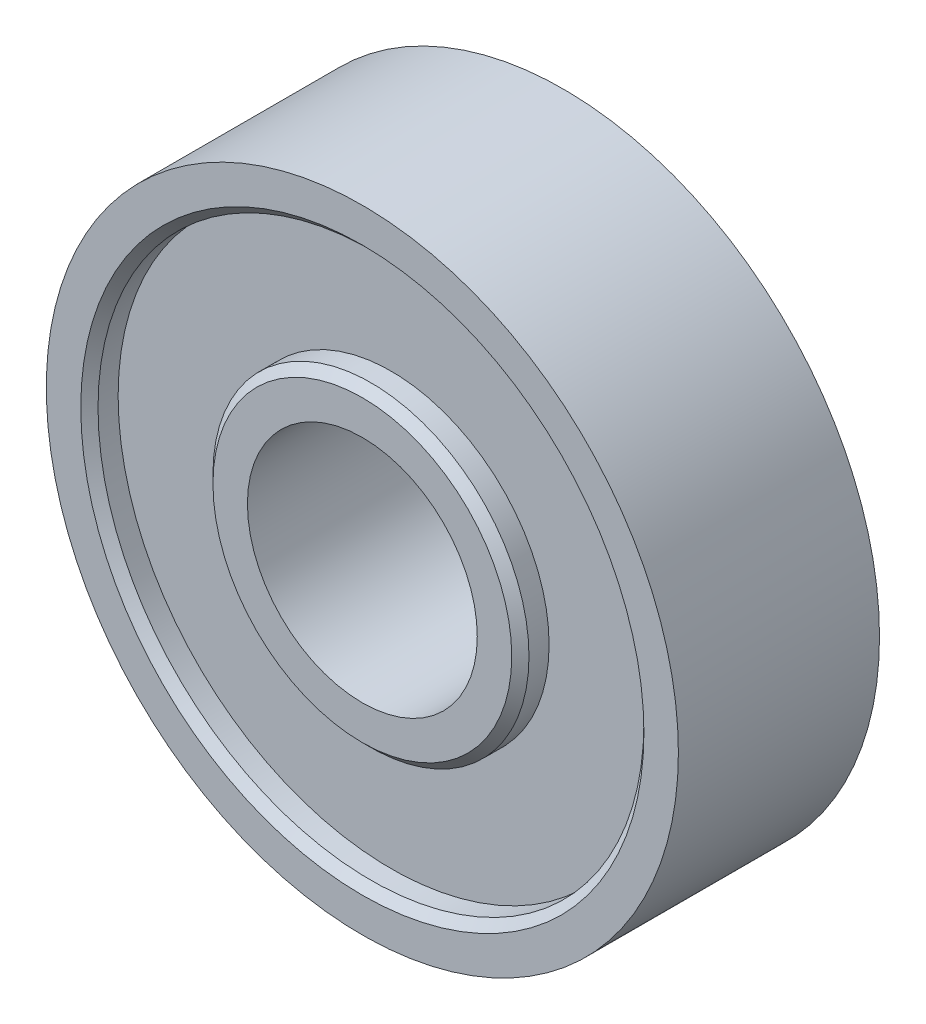
ISO-10303-21;
HEADER;
FILE_DESCRIPTION(('STEP AP214'),'2;1');
FILE_NAME('part.step','',(''),(''),'','','');
FILE_SCHEMA(('AUTOMOTIVE_DESIGN { 1 0 10303 214 1 1 1 1 }'));
ENDSEC;
DATA;
#1=APPLICATION_CONTEXT('core data for automotive mechanical design processes');
#2=APPLICATION_PROTOCOL_DEFINITION('international standard','automotive_design',2000,#1);
#3=PRODUCT_CONTEXT('',#1,'mechanical');
#4=PRODUCT('Part','Part','',(#3));
#5=PRODUCT_RELATED_PRODUCT_CATEGORY('part','',(#4));
#6=PRODUCT_DEFINITION_FORMATION('','',#4);
#7=PRODUCT_DEFINITION_CONTEXT('part definition',#1,'design');
#8=PRODUCT_DEFINITION('design','',#6,#7);
#9=PRODUCT_DEFINITION_SHAPE('','',#8);
#10=(LENGTH_UNIT() NAMED_UNIT(*) SI_UNIT(.MILLI.,.METRE.));
#11=(NAMED_UNIT(*) PLANE_ANGLE_UNIT() SI_UNIT($,.RADIAN.));
#12=(NAMED_UNIT(*) SI_UNIT($,.STERADIAN.) SOLID_ANGLE_UNIT());
#13=UNCERTAINTY_MEASURE_WITH_UNIT(LENGTH_MEASURE(1.E-05),#10,'distance_accuracy_value','');
#14=(GEOMETRIC_REPRESENTATION_CONTEXT(3) GLOBAL_UNCERTAINTY_ASSIGNED_CONTEXT((#13)) GLOBAL_UNIT_ASSIGNED_CONTEXT((#10,
#11,#12)) REPRESENTATION_CONTEXT('',''));
#15=CARTESIAN_POINT('',(0.,0.,0.));
#16=DIRECTION('',(0.,0.,1.));
#17=DIRECTION('',(1.,0.,0.));
#18=AXIS2_PLACEMENT_3D('',#15,#16,#17);
#19=CARTESIAN_POINT('',(0.,0.,-3.5));
#20=DIRECTION('',(0.,0.,1.));
#21=DIRECTION('',(1.,0.,0.));
#22=AXIS2_PLACEMENT_3D('',#19,#20,#21);
#23=PLANE('',#22);
#24=CARTESIAN_POINT('',(0.,0.,-3.5));
#25=DIRECTION('',(0.,0.,1.));
#26=DIRECTION('',(1.,0.,0.));
#27=AXIS2_PLACEMENT_3D('',#24,#25,#26);
#28=CIRCLE('',#27,5.2);
#29=CARTESIAN_POINT('',(5.2,0.,-3.5));
#30=VERTEX_POINT('',#29);
#31=EDGE_CURVE('E87',#30,#30,#28,.F.);
#32=ORIENTED_EDGE('',*,*,#31,.T.);
#33=EDGE_LOOP('',(#32));
#34=FACE_BOUND('',#33,.T.);
#35=CARTESIAN_POINT('',(0.,0.,-3.5));
#36=DIRECTION('',(0.,0.,1.));
#37=DIRECTION('',(1.,0.,0.));
#38=AXIS2_PLACEMENT_3D('',#35,#36,#37);
#39=CIRCLE('',#38,4.);
#40=CARTESIAN_POINT('',(4.,0.,-3.5));
#41=VERTEX_POINT('',#40);
#42=EDGE_CURVE('E107',#41,#41,#39,.T.);
#43=ORIENTED_EDGE('',*,*,#42,.T.);
#44=EDGE_LOOP('',(#43));
#45=FACE_BOUND('',#44,.T.);
#46=ADVANCED_FACE('F46',(#34,#45),#23,.F.);
#47=CARTESIAN_POINT('',(0.,0.,3.5));
#48=DIRECTION('',(0.,0.,1.));
#49=DIRECTION('',(1.,0.,0.));
#50=AXIS2_PLACEMENT_3D('',#47,#48,#49);
#51=PLANE('',#50);
#52=CARTESIAN_POINT('',(0.,0.,3.5));
#53=DIRECTION('',(0.,0.,1.));
#54=DIRECTION('',(1.,0.,0.));
#55=AXIS2_PLACEMENT_3D('',#52,#53,#54);
#56=CIRCLE('',#55,5.2);
#57=CARTESIAN_POINT('',(5.2,0.,3.5));
#58=VERTEX_POINT('',#57);
#59=EDGE_CURVE('E117',#58,#58,#56,.T.);
#60=ORIENTED_EDGE('',*,*,#59,.T.);
#61=EDGE_LOOP('',(#60));
#62=FACE_BOUND('',#61,.T.);
#63=CARTESIAN_POINT('',(0.,0.,3.5));
#64=DIRECTION('',(0.,0.,1.));
#65=DIRECTION('',(1.,0.,0.));
#66=AXIS2_PLACEMENT_3D('',#63,#64,#65);
#67=CIRCLE('',#66,4.);
#68=CARTESIAN_POINT('',(4.,0.,3.5));
#69=VERTEX_POINT('',#68);
#70=EDGE_CURVE('E80',#69,#69,#67,.T.);
#71=ORIENTED_EDGE('',*,*,#70,.F.);
#72=EDGE_LOOP('',(#71));
#73=FACE_BOUND('',#72,.T.);
#74=ADVANCED_FACE('F156',(#62,#73),#51,.T.);
#75=CARTESIAN_POINT('',(0.,0.,3.5));
#76=DIRECTION('',(0.,0.,1.));
#77=DIRECTION('',(1.,0.,0.));
#78=AXIS2_PLACEMENT_3D('',#75,#76,#77);
#79=CIRCLE('',#78,9.79999999999999);
#80=CARTESIAN_POINT('',(9.79999999999999,0.,3.5));
#81=VERTEX_POINT('',#80);
#82=EDGE_CURVE('E57',#81,#81,#79,.F.);
#83=ORIENTED_EDGE('',*,*,#82,.T.);
#84=EDGE_LOOP('',(#83));
#85=FACE_BOUND('',#84,.T.);
#86=CARTESIAN_POINT('',(0.,0.,3.5));
#87=DIRECTION('',(0.,0.,1.));
#88=DIRECTION('',(1.,0.,0.));
#89=AXIS2_PLACEMENT_3D('',#86,#87,#88);
#90=CIRCLE('',#89,11.);
#91=CARTESIAN_POINT('',(11.,0.,3.5));
#92=VERTEX_POINT('',#91);
#93=EDGE_CURVE('E79',#92,#92,#90,.T.);
#94=ORIENTED_EDGE('',*,*,#93,.T.);
#95=EDGE_LOOP('',(#94));
#96=FACE_BOUND('',#95,.T.);
#97=ADVANCED_FACE('F162',(#85,#96),#51,.T.);
#98=CARTESIAN_POINT('',(0.,0.,-3.5));
#99=DIRECTION('',(0.,0.,1.));
#100=DIRECTION('',(1.,0.,0.));
#101=AXIS2_PLACEMENT_3D('',#98,#99,#100);
#102=CIRCLE('',#101,9.8);
#103=CARTESIAN_POINT('',(9.8,0.,-3.5));
#104=VERTEX_POINT('',#103);
#105=EDGE_CURVE('E53',#104,#104,#102,.T.);
#106=ORIENTED_EDGE('',*,*,#105,.T.);
#107=EDGE_LOOP('',(#106));
#108=FACE_BOUND('',#107,.T.);
#109=CARTESIAN_POINT('',(0.,0.,-3.5));
#110=DIRECTION('',(0.,0.,1.));
#111=DIRECTION('',(1.,0.,0.));
#112=AXIS2_PLACEMENT_3D('',#109,#110,#111);
#113=CIRCLE('',#112,11.);
#114=CARTESIAN_POINT('',(11.,0.,-3.5));
#115=VERTEX_POINT('',#114);
#116=EDGE_CURVE('E74',#115,#115,#113,.T.);
#117=ORIENTED_EDGE('',*,*,#116,.F.);
#118=EDGE_LOOP('',(#117));
#119=FACE_BOUND('',#118,.T.);
#120=ADVANCED_FACE('F158',(#108,#119),#23,.F.);
#121=CARTESIAN_POINT('',(0.,0.,3.5));
#122=DIRECTION('',(0.,0.,-1.));
#123=DIRECTION('',(-1.,0.,0.));
#124=AXIS2_PLACEMENT_3D('',#121,#122,#123);
#125=CYLINDRICAL_SURFACE('',#124,11.);
#126=ORIENTED_EDGE('',*,*,#93,.F.);
#127=EDGE_LOOP('',(#126));
#128=FACE_BOUND('',#127,.T.);
#129=ORIENTED_EDGE('',*,*,#116,.T.);
#130=EDGE_LOOP('',(#129));
#131=FACE_BOUND('',#130,.T.);
#132=ADVANCED_FACE('F166',(#128,#131),#125,.T.);
#133=CARTESIAN_POINT('',(0.,0.,3.5));
#134=DIRECTION('',(0.,0.,-1.));
#135=DIRECTION('',(-1.,0.,0.));
#136=AXIS2_PLACEMENT_3D('',#133,#134,#135);
#137=CYLINDRICAL_SURFACE('',#136,4.);
#138=ORIENTED_EDGE('',*,*,#70,.T.);
#139=EDGE_LOOP('',(#138));
#140=FACE_BOUND('',#139,.T.);
#141=ORIENTED_EDGE('',*,*,#42,.F.);
#142=EDGE_LOOP('',(#141));
#143=FACE_BOUND('',#142,.T.);
#144=ADVANCED_FACE('F171',(#140,#143),#137,.F.);
#145=CARTESIAN_POINT('',(0.,0.,2.5));
#146=DIRECTION('',(0.,0.,1.));
#147=DIRECTION('',(1.,0.,0.));
#148=AXIS2_PLACEMENT_3D('',#145,#146,#147);
#149=CYLINDRICAL_SURFACE('',#148,9.5);
#150=CARTESIAN_POINT('',(0.,0.,3.20000000000001));
#151=DIRECTION('',(0.,0.,1.));
#152=DIRECTION('',(1.,0.,0.));
#153=AXIS2_PLACEMENT_3D('',#150,#151,#152);
#154=CIRCLE('',#153,9.5);
#155=CARTESIAN_POINT('',(9.5,0.,3.20000000000001));
#156=VERTEX_POINT('',#155);
#157=EDGE_CURVE('E61',#156,#156,#154,.T.);
#158=ORIENTED_EDGE('',*,*,#157,.T.);
#159=EDGE_LOOP('',(#158));
#160=FACE_BOUND('',#159,.T.);
#161=CARTESIAN_POINT('',(0.,0.,2.5));
#162=DIRECTION('',(0.,0.,1.));
#163=DIRECTION('',(1.,0.,0.));
#164=AXIS2_PLACEMENT_3D('',#161,#162,#163);
#165=CIRCLE('',#164,9.5);
#166=CARTESIAN_POINT('',(9.5,0.,2.5));
#167=VERTEX_POINT('',#166);
#168=EDGE_CURVE('E103',#167,#167,#165,.T.);
#169=ORIENTED_EDGE('',*,*,#168,.F.);
#170=EDGE_LOOP('',(#169));
#171=FACE_BOUND('',#170,.T.);
#172=ADVANCED_FACE('F183',(#160,#171),#149,.F.);
#173=CARTESIAN_POINT('',(0.,0.,2.5));
#174=DIRECTION('',(0.,0.,1.));
#175=DIRECTION('',(1.,0.,0.));
#176=AXIS2_PLACEMENT_3D('',#173,#174,#175);
#177=PLANE('',#176);
#178=CARTESIAN_POINT('',(0.,0.,2.5));
#179=DIRECTION('',(0.,0.,1.));
#180=DIRECTION('',(1.,0.,0.));
#181=AXIS2_PLACEMENT_3D('',#178,#179,#180);
#182=CIRCLE('',#181,5.5);
#183=CARTESIAN_POINT('',(5.5,0.,2.5));
#184=VERTEX_POINT('',#183);
#185=EDGE_CURVE('E99',#184,#184,#182,.T.);
#186=ORIENTED_EDGE('',*,*,#185,.F.);
#187=EDGE_LOOP('',(#186));
#188=FACE_BOUND('',#187,.T.);
#189=ORIENTED_EDGE('',*,*,#168,.T.);
#190=EDGE_LOOP('',(#189));
#191=FACE_BOUND('',#190,.T.);
#192=ADVANCED_FACE('F151',(#188,#191),#177,.T.);
#193=CARTESIAN_POINT('',(0.,0.,2.5));
#194=DIRECTION('',(0.,0.,1.));
#195=DIRECTION('',(1.,0.,0.));
#196=AXIS2_PLACEMENT_3D('',#193,#194,#195);
#197=CYLINDRICAL_SURFACE('',#196,5.5);
#198=CARTESIAN_POINT('',(0.,0.,3.2));
#199=DIRECTION('',(0.,0.,1.));
#200=DIRECTION('',(1.,0.,0.));
#201=AXIS2_PLACEMENT_3D('',#198,#199,#200);
#202=CIRCLE('',#201,5.5);
#203=CARTESIAN_POINT('',(5.5,0.,3.2));
#204=VERTEX_POINT('',#203);
#205=EDGE_CURVE('E115',#204,#204,#202,.F.);
#206=ORIENTED_EDGE('',*,*,#205,.T.);
#207=EDGE_LOOP('',(#206));
#208=FACE_BOUND('',#207,.T.);
#209=ORIENTED_EDGE('',*,*,#185,.T.);
#210=EDGE_LOOP('',(#209));
#211=FACE_BOUND('',#210,.T.);
#212=ADVANCED_FACE('F143',(#208,#211),#197,.T.);
#213=CARTESIAN_POINT('',(0.,0.,-2.5));
#214=DIRECTION('',(0.,0.,-1.));
#215=DIRECTION('',(1.,0.,0.));
#216=AXIS2_PLACEMENT_3D('',#213,#214,#215);
#217=PLANE('',#216);
#218=CARTESIAN_POINT('',(0.,0.,-2.5));
#219=DIRECTION('',(0.,0.,1.));
#220=DIRECTION('',(1.,0.,0.));
#221=AXIS2_PLACEMENT_3D('',#218,#219,#220);
#222=CIRCLE('',#221,9.5);
#223=CARTESIAN_POINT('',(9.5,0.,-2.5));
#224=VERTEX_POINT('',#223);
#225=EDGE_CURVE('E96',#224,#224,#222,.T.);
#226=ORIENTED_EDGE('',*,*,#225,.F.);
#227=EDGE_LOOP('',(#226));
#228=FACE_BOUND('',#227,.T.);
#229=CARTESIAN_POINT('',(0.,0.,-2.5));
#230=DIRECTION('',(0.,0.,1.));
#231=DIRECTION('',(1.,0.,0.));
#232=AXIS2_PLACEMENT_3D('',#229,#230,#231);
#233=CIRCLE('',#232,5.5);
#234=CARTESIAN_POINT('',(5.5,0.,-2.5));
#235=VERTEX_POINT('',#234);
#236=EDGE_CURVE('E93',#235,#235,#233,.T.);
#237=ORIENTED_EDGE('',*,*,#236,.T.);
#238=EDGE_LOOP('',(#237));
#239=FACE_BOUND('',#238,.T.);
#240=ADVANCED_FACE('F141',(#228,#239),#217,.T.);
#241=CARTESIAN_POINT('',(0.,0.,-2.5));
#242=DIRECTION('',(0.,0.,-1.));
#243=DIRECTION('',(-1.,0.,0.));
#244=AXIS2_PLACEMENT_3D('',#241,#242,#243);
#245=CYLINDRICAL_SURFACE('',#244,9.5);
#246=CARTESIAN_POINT('',(0.,0.,-3.2));
#247=DIRECTION('',(0.,0.,1.));
#248=DIRECTION('',(1.,0.,0.));
#249=AXIS2_PLACEMENT_3D('',#246,#247,#248);
#250=CIRCLE('',#249,9.5);
#251=CARTESIAN_POINT('',(9.5,0.,-3.2));
#252=VERTEX_POINT('',#251);
#253=EDGE_CURVE('E12',#252,#252,#250,.F.);
#254=ORIENTED_EDGE('',*,*,#253,.T.);
#255=EDGE_LOOP('',(#254));
#256=FACE_BOUND('',#255,.T.);
#257=ORIENTED_EDGE('',*,*,#225,.T.);
#258=EDGE_LOOP('',(#257));
#259=FACE_BOUND('',#258,.T.);
#260=ADVANCED_FACE('F137',(#256,#259),#245,.F.);
#261=CARTESIAN_POINT('',(0.,0.,-2.5));
#262=DIRECTION('',(0.,0.,-1.));
#263=DIRECTION('',(-1.,0.,0.));
#264=AXIS2_PLACEMENT_3D('',#261,#262,#263);
#265=CYLINDRICAL_SURFACE('',#264,5.5);
#266=CARTESIAN_POINT('',(0.,0.,-3.2));
#267=DIRECTION('',(0.,0.,1.));
#268=DIRECTION('',(1.,0.,0.));
#269=AXIS2_PLACEMENT_3D('',#266,#267,#268);
#270=CIRCLE('',#269,5.5);
#271=CARTESIAN_POINT('',(5.5,0.,-3.2));
#272=VERTEX_POINT('',#271);
#273=EDGE_CURVE('E83',#272,#272,#270,.T.);
#274=ORIENTED_EDGE('',*,*,#273,.T.);
#275=EDGE_LOOP('',(#274));
#276=FACE_BOUND('',#275,.T.);
#277=ORIENTED_EDGE('',*,*,#236,.F.);
#278=EDGE_LOOP('',(#277));
#279=FACE_BOUND('',#278,.T.);
#280=ADVANCED_FACE('F131',(#276,#279),#265,.T.);
#281=CARTESIAN_POINT('',(0.,0.,-3.2));
#282=DIRECTION('',(0.,0.,1.));
#283=DIRECTION('',(1.,0.,0.));
#284=AXIS2_PLACEMENT_3D('',#281,#282,#283);
#285=CONICAL_SURFACE('',#284,5.5,0.785398163397451);
#286=ORIENTED_EDGE('',*,*,#31,.F.);
#287=EDGE_LOOP('',(#286));
#288=FACE_BOUND('',#287,.T.);
#289=ORIENTED_EDGE('',*,*,#273,.F.);
#290=EDGE_LOOP('',(#289));
#291=FACE_BOUND('',#290,.T.);
#292=ADVANCED_FACE('F127',(#288,#291),#285,.T.);
#293=CARTESIAN_POINT('',(0.,0.,3.5));
#294=DIRECTION('',(0.,0.,-1.));
#295=DIRECTION('',(-1.,0.,0.));
#296=AXIS2_PLACEMENT_3D('',#293,#294,#295);
#297=CONICAL_SURFACE('',#296,5.2,0.785398163397451);
#298=ORIENTED_EDGE('',*,*,#205,.F.);
#299=EDGE_LOOP('',(#298));
#300=FACE_BOUND('',#299,.T.);
#301=ORIENTED_EDGE('',*,*,#59,.F.);
#302=EDGE_LOOP('',(#301));
#303=FACE_BOUND('',#302,.T.);
#304=ADVANCED_FACE('F130',(#300,#303),#297,.T.);
#305=CARTESIAN_POINT('',(0.,0.,3.20000000000001));
#306=DIRECTION('',(0.,0.,1.));
#307=DIRECTION('',(1.,0.,0.));
#308=AXIS2_PLACEMENT_3D('',#305,#306,#307);
#309=CONICAL_SURFACE('',#308,9.5,0.785398163397448);
#310=ORIENTED_EDGE('',*,*,#82,.F.);
#311=EDGE_LOOP('',(#310));
#312=FACE_BOUND('',#311,.T.);
#313=ORIENTED_EDGE('',*,*,#157,.F.);
#314=EDGE_LOOP('',(#313));
#315=FACE_BOUND('',#314,.T.);
#316=ADVANCED_FACE('F242',(#312,#315),#309,.F.);
#317=CARTESIAN_POINT('',(0.,0.,-3.5));
#318=DIRECTION('',(0.,0.,-1.));
#319=DIRECTION('',(-1.,0.,0.));
#320=AXIS2_PLACEMENT_3D('',#317,#318,#319);
#321=CONICAL_SURFACE('',#320,9.8,0.785398163397443);
#322=ORIENTED_EDGE('',*,*,#253,.F.);
#323=EDGE_LOOP('',(#322));
#324=FACE_BOUND('',#323,.T.);
#325=ORIENTED_EDGE('',*,*,#105,.F.);
#326=EDGE_LOOP('',(#325));
#327=FACE_BOUND('',#326,.T.);
#328=ADVANCED_FACE('F48',(#324,#327),#321,.F.);
#329=CLOSED_SHELL('',(#46,#74,#97,#120,#132,#144,#172,#192,#212,#240,#260,#280,#292,#304,#316,#328));
#330=MANIFOLD_SOLID_BREP('B2',#329);
#331=ADVANCED_BREP_SHAPE_REPRESENTATION('',(#18,#330),#14);
#332=SHAPE_DEFINITION_REPRESENTATION(#9,#331);
ENDSEC;
END-ISO-10303-21;
